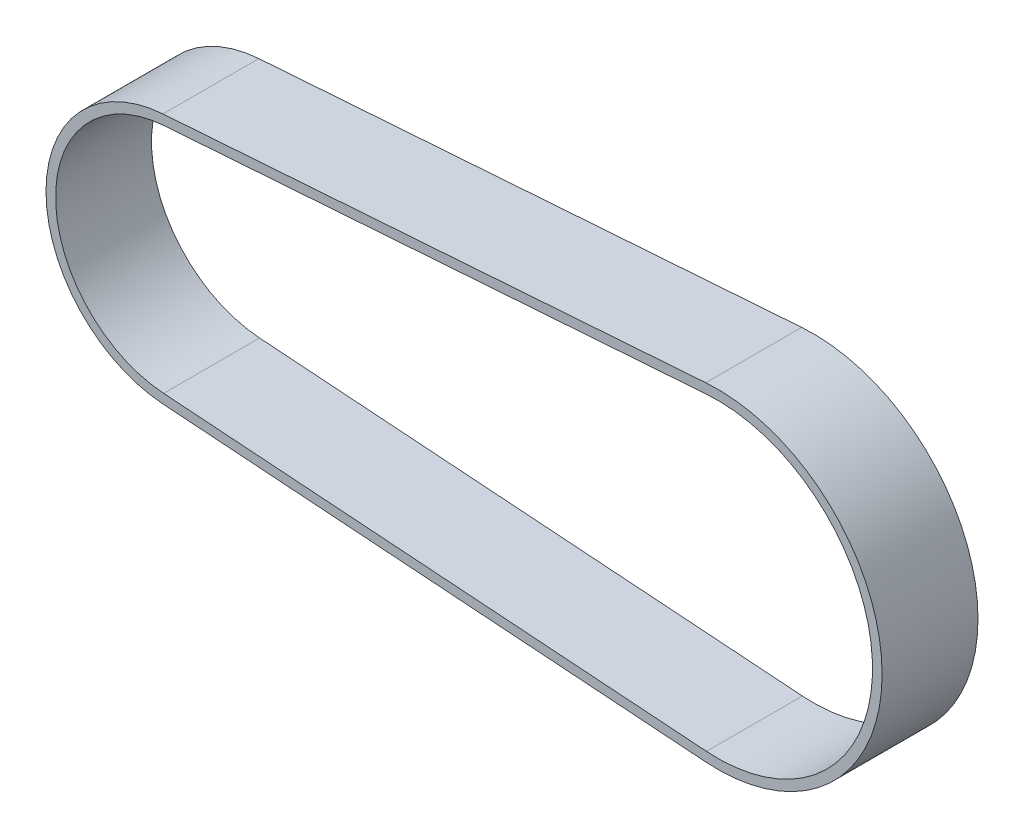
ISO-10303-21;
HEADER;
FILE_DESCRIPTION(('STEP AP214'),'2;1');
FILE_NAME('part.step','',(''),(''),'','','');
FILE_SCHEMA(('AUTOMOTIVE_DESIGN { 1 0 10303 214 1 1 1 1 }'));
ENDSEC;
DATA;
#1=APPLICATION_CONTEXT('core data for automotive mechanical design processes');
#2=APPLICATION_PROTOCOL_DEFINITION('international standard','automotive_design',2000,#1);
#3=PRODUCT_CONTEXT('',#1,'mechanical');
#4=PRODUCT('Part','Part','',(#3));
#5=PRODUCT_RELATED_PRODUCT_CATEGORY('part','',(#4));
#6=PRODUCT_DEFINITION_FORMATION('','',#4);
#7=PRODUCT_DEFINITION_CONTEXT('part definition',#1,'design');
#8=PRODUCT_DEFINITION('design','',#6,#7);
#9=PRODUCT_DEFINITION_SHAPE('','',#8);
#10=(LENGTH_UNIT() NAMED_UNIT(*) SI_UNIT(.MILLI.,.METRE.));
#11=(NAMED_UNIT(*) PLANE_ANGLE_UNIT() SI_UNIT($,.RADIAN.));
#12=(NAMED_UNIT(*) SI_UNIT($,.STERADIAN.) SOLID_ANGLE_UNIT());
#13=UNCERTAINTY_MEASURE_WITH_UNIT(LENGTH_MEASURE(1.E-05),#10,'distance_accuracy_value','');
#14=(GEOMETRIC_REPRESENTATION_CONTEXT(3) GLOBAL_UNCERTAINTY_ASSIGNED_CONTEXT((#13)) GLOBAL_UNIT_ASSIGNED_CONTEXT((#10,
#11,#12)) REPRESENTATION_CONTEXT('',''));
#15=CARTESIAN_POINT('',(0.,0.,0.));
#16=DIRECTION('',(0.,0.,1.));
#17=DIRECTION('',(1.,0.,0.));
#18=AXIS2_PLACEMENT_3D('',#15,#16,#17);
#19=CARTESIAN_POINT('',(0.,0.,5.));
#20=DIRECTION('',(0.,0.,-1.));
#21=DIRECTION('',(-1.,0.,0.));
#22=AXIS2_PLACEMENT_3D('',#19,#20,#21);
#23=PLANE('',#22);
#24=CARTESIAN_POINT('',(0.,0.,5.));
#25=DIRECTION('',(0.,0.,-1.));
#26=DIRECTION('',(-1.,0.,0.));
#27=AXIS2_PLACEMENT_3D('',#24,#25,#26);
#28=CIRCLE('',#27,13.13);
#29=CARTESIAN_POINT('',(-0.932357602726097,13.0968549392837,5.));
#30=VERTEX_POINT('',#29);
#31=CARTESIAN_POINT('',(-0.9323576027261,-13.0968549392837,5.));
#32=VERTEX_POINT('',#31);
#33=EDGE_CURVE('E158',#30,#32,#28,.F.);
#34=ORIENTED_EDGE('',*,*,#33,.T.);
#35=DIRECTION('',(0.997475623707819,-0.0710097184102131,0.));
#36=VECTOR('',#35,1.);
#37=CARTESIAN_POINT('',(-0.932357602726098,-13.0968549392837,5.));
#38=LINE('',#37,#36);
#39=CARTESIAN_POINT('',(55.6743840426926,-17.1266564590633,5.));
#40=VERTEX_POINT('',#39);
#41=EDGE_CURVE('E161',#32,#40,#38,.T.);
#42=ORIENTED_EDGE('',*,*,#41,.T.);
#43=CARTESIAN_POINT('',(56.893620907796,0.,5.));
#44=DIRECTION('',(0.,0.,-1.));
#45=DIRECTION('',(-1.,0.,0.));
#46=AXIS2_PLACEMENT_3D('',#43,#44,#45);
#47=CIRCLE('',#46,17.17);
#48=CARTESIAN_POINT('',(55.6743840426926,17.1266564590632,5.));
#49=VERTEX_POINT('',#48);
#50=EDGE_CURVE('E164',#40,#49,#47,.F.);
#51=ORIENTED_EDGE('',*,*,#50,.T.);
#52=DIRECTION('',(-0.997475623707819,-0.071009718410213,0.));
#53=VECTOR('',#52,1.);
#54=CARTESIAN_POINT('',(-0.932357602726096,13.0968549392837,5.));
#55=LINE('',#54,#53);
#56=EDGE_CURVE('E166',#49,#30,#55,.T.);
#57=ORIENTED_EDGE('',*,*,#56,.T.);
#58=EDGE_LOOP('',(#34,#42,#51,#57));
#59=FACE_BOUND('',#58,.T.);
#60=CARTESIAN_POINT('',(0.,0.,5.));
#61=DIRECTION('',(0.,0.,1.));
#62=DIRECTION('',(-1.,0.,0.));
#63=AXIS2_PLACEMENT_3D('',#60,#61,#62);
#64=CIRCLE('',#63,12.13);
#65=CARTESIAN_POINT('',(-0.861347884315884,12.0993793155758,5.));
#66=VERTEX_POINT('',#65);
#67=CARTESIAN_POINT('',(-0.861347884315884,-12.0993793155758,5.));
#68=VERTEX_POINT('',#67);
#69=EDGE_CURVE('E122',#66,#68,#64,.T.);
#70=ORIENTED_EDGE('',*,*,#69,.F.);
#71=DIRECTION('',(-0.997475623707819,-0.0710097184102129,0.));
#72=VECTOR('',#71,1.);
#73=CARTESIAN_POINT('',(-0.861347884315884,12.0993793155758,5.));
#74=LINE('',#73,#72);
#75=CARTESIAN_POINT('',(55.7453937611028,16.1291808353554,5.));
#76=VERTEX_POINT('',#75);
#77=EDGE_CURVE('E144',#76,#66,#74,.T.);
#78=ORIENTED_EDGE('',*,*,#77,.F.);
#79=CARTESIAN_POINT('',(56.893620907796,0.,5.));
#80=DIRECTION('',(0.,0.,1.));
#81=DIRECTION('',(-1.,0.,0.));
#82=AXIS2_PLACEMENT_3D('',#79,#80,#81);
#83=CIRCLE('',#82,16.17);
#84=CARTESIAN_POINT('',(55.7453937611028,-16.1291808353554,5.));
#85=VERTEX_POINT('',#84);
#86=EDGE_CURVE('E142',#85,#76,#83,.T.);
#87=ORIENTED_EDGE('',*,*,#86,.F.);
#88=DIRECTION('',(0.997475623707819,-0.0710097184102131,0.));
#89=VECTOR('',#88,1.);
#90=CARTESIAN_POINT('',(55.7453937611028,-16.1291808353554,5.));
#91=LINE('',#90,#89);
#92=EDGE_CURVE('E130',#68,#85,#91,.T.);
#93=ORIENTED_EDGE('',*,*,#92,.F.);
#94=EDGE_LOOP('',(#70,#78,#87,#93));
#95=FACE_BOUND('',#94,.T.);
#96=ADVANCED_FACE('F57',(#59,#95),#23,.F.);
#97=CARTESIAN_POINT('',(0.,0.,-5.));
#98=DIRECTION('',(0.,0.,-1.));
#99=DIRECTION('',(-1.,0.,0.));
#100=AXIS2_PLACEMENT_3D('',#97,#98,#99);
#101=PLANE('',#100);
#102=CARTESIAN_POINT('',(0.,0.,-5.));
#103=DIRECTION('',(0.,0.,-1.));
#104=DIRECTION('',(-1.,0.,0.));
#105=AXIS2_PLACEMENT_3D('',#102,#103,#104);
#106=CIRCLE('',#105,13.13);
#107=CARTESIAN_POINT('',(-0.932357602726097,13.0968549392837,-5.));
#108=VERTEX_POINT('',#107);
#109=CARTESIAN_POINT('',(-0.9323576027261,-13.0968549392837,-5.));
#110=VERTEX_POINT('',#109);
#111=EDGE_CURVE('E138',#108,#110,#106,.F.);
#112=ORIENTED_EDGE('',*,*,#111,.F.);
#113=DIRECTION('',(-0.997475623707819,-0.071009718410213,0.));
#114=VECTOR('',#113,1.);
#115=CARTESIAN_POINT('',(-0.932357602726096,13.0968549392837,-5.));
#116=LINE('',#115,#114);
#117=CARTESIAN_POINT('',(55.6743840426926,17.1266564590632,-5.));
#118=VERTEX_POINT('',#117);
#119=EDGE_CURVE('E162',#118,#108,#116,.T.);
#120=ORIENTED_EDGE('',*,*,#119,.F.);
#121=CARTESIAN_POINT('',(56.893620907796,0.,-5.));
#122=DIRECTION('',(0.,0.,-1.));
#123=DIRECTION('',(-1.,0.,0.));
#124=AXIS2_PLACEMENT_3D('',#121,#122,#123);
#125=CIRCLE('',#124,17.17);
#126=CARTESIAN_POINT('',(55.6743840426926,-17.1266564590633,-5.));
#127=VERTEX_POINT('',#126);
#128=EDGE_CURVE('E173',#127,#118,#125,.F.);
#129=ORIENTED_EDGE('',*,*,#128,.F.);
#130=DIRECTION('',(0.997475623707819,-0.0710097184102131,0.));
#131=VECTOR('',#130,1.);
#132=CARTESIAN_POINT('',(-0.932357602726098,-13.0968549392837,-5.));
#133=LINE('',#132,#131);
#134=EDGE_CURVE('E171',#110,#127,#133,.T.);
#135=ORIENTED_EDGE('',*,*,#134,.F.);
#136=EDGE_LOOP('',(#112,#120,#129,#135));
#137=FACE_BOUND('',#136,.T.);
#138=DIRECTION('',(-0.997475623707819,-0.0710097184102129,0.));
#139=VECTOR('',#138,1.);
#140=CARTESIAN_POINT('',(-0.861347884315884,12.0993793155758,-5.));
#141=LINE('',#140,#139);
#142=CARTESIAN_POINT('',(55.7453937611028,16.1291808353554,-5.));
#143=VERTEX_POINT('',#142);
#144=CARTESIAN_POINT('',(-0.861347884315884,12.0993793155758,-5.));
#145=VERTEX_POINT('',#144);
#146=EDGE_CURVE('E131',#143,#145,#141,.T.);
#147=ORIENTED_EDGE('',*,*,#146,.T.);
#148=CARTESIAN_POINT('',(0.,0.,-5.));
#149=DIRECTION('',(0.,0.,1.));
#150=DIRECTION('',(-1.,0.,0.));
#151=AXIS2_PLACEMENT_3D('',#148,#149,#150);
#152=CIRCLE('',#151,12.13);
#153=CARTESIAN_POINT('',(-0.861347884315884,-12.0993793155758,-5.));
#154=VERTEX_POINT('',#153);
#155=EDGE_CURVE('E80',#145,#154,#152,.T.);
#156=ORIENTED_EDGE('',*,*,#155,.T.);
#157=DIRECTION('',(0.997475623707819,-0.0710097184102131,0.));
#158=VECTOR('',#157,1.);
#159=CARTESIAN_POINT('',(55.7453937611028,-16.1291808353554,-5.));
#160=LINE('',#159,#158);
#161=CARTESIAN_POINT('',(55.7453937611028,-16.1291808353554,-5.));
#162=VERTEX_POINT('',#161);
#163=EDGE_CURVE('E137',#154,#162,#160,.T.);
#164=ORIENTED_EDGE('',*,*,#163,.T.);
#165=CARTESIAN_POINT('',(56.893620907796,0.,-5.));
#166=DIRECTION('',(0.,0.,1.));
#167=DIRECTION('',(-1.,0.,0.));
#168=AXIS2_PLACEMENT_3D('',#165,#166,#167);
#169=CIRCLE('',#168,16.17);
#170=EDGE_CURVE('E150',#162,#143,#169,.T.);
#171=ORIENTED_EDGE('',*,*,#170,.T.);
#172=EDGE_LOOP('',(#147,#156,#164,#171));
#173=FACE_BOUND('',#172,.T.);
#174=ADVANCED_FACE('F191',(#137,#173),#101,.T.);
#175=CARTESIAN_POINT('',(0.,0.,5.));
#176=DIRECTION('',(0.,0.,-1.));
#177=DIRECTION('',(-1.,0.,0.));
#178=AXIS2_PLACEMENT_3D('',#175,#176,#177);
#179=CYLINDRICAL_SURFACE('',#178,13.13);
#180=ORIENTED_EDGE('',*,*,#111,.T.);
#181=DIRECTION('',(0.,0.,-1.));
#182=VECTOR('',#181,1.);
#183=CARTESIAN_POINT('',(-0.9323576027261,-13.0968549392837,5.));
#184=LINE('',#183,#182);
#185=EDGE_CURVE('E12',#32,#110,#184,.T.);
#186=ORIENTED_EDGE('',*,*,#185,.F.);
#187=ORIENTED_EDGE('',*,*,#33,.F.);
#188=DIRECTION('',(0.,0.,-1.));
#189=VECTOR('',#188,1.);
#190=CARTESIAN_POINT('',(-0.932357602726097,13.0968549392837,5.));
#191=LINE('',#190,#189);
#192=EDGE_CURVE('E168',#30,#108,#191,.T.);
#193=ORIENTED_EDGE('',*,*,#192,.T.);
#194=EDGE_LOOP('',(#180,#186,#187,#193));
#195=FACE_BOUND('',#194,.T.);
#196=ADVANCED_FACE('F59',(#195),#179,.T.);
#197=CARTESIAN_POINT('',(-0.932357602726098,-13.0968549392837,5.));
#198=DIRECTION('',(0.0710097184102131,0.997475623707819,0.));
#199=DIRECTION('',(-0.997475623707819,0.0710097184102131,0.));
#200=AXIS2_PLACEMENT_3D('',#197,#198,#199);
#201=PLANE('',#200);
#202=ORIENTED_EDGE('',*,*,#134,.T.);
#203=DIRECTION('',(0.,0.,-1.));
#204=VECTOR('',#203,1.);
#205=CARTESIAN_POINT('',(55.6743840426926,-17.1266564590633,5.));
#206=LINE('',#205,#204);
#207=EDGE_CURVE('E65',#40,#127,#206,.T.);
#208=ORIENTED_EDGE('',*,*,#207,.F.);
#209=ORIENTED_EDGE('',*,*,#41,.F.);
#210=ORIENTED_EDGE('',*,*,#185,.T.);
#211=EDGE_LOOP('',(#202,#208,#209,#210));
#212=FACE_BOUND('',#211,.T.);
#213=ADVANCED_FACE('F201',(#212),#201,.F.);
#214=CARTESIAN_POINT('',(56.893620907796,0.,5.));
#215=DIRECTION('',(0.,0.,-1.));
#216=DIRECTION('',(-1.,0.,0.));
#217=AXIS2_PLACEMENT_3D('',#214,#215,#216);
#218=CYLINDRICAL_SURFACE('',#217,17.17);
#219=ORIENTED_EDGE('',*,*,#128,.T.);
#220=DIRECTION('',(0.,0.,-1.));
#221=VECTOR('',#220,1.);
#222=CARTESIAN_POINT('',(55.6743840426926,17.1266564590632,5.));
#223=LINE('',#222,#221);
#224=EDGE_CURVE('E178',#49,#118,#223,.T.);
#225=ORIENTED_EDGE('',*,*,#224,.F.);
#226=ORIENTED_EDGE('',*,*,#50,.F.);
#227=ORIENTED_EDGE('',*,*,#207,.T.);
#228=EDGE_LOOP('',(#219,#225,#226,#227));
#229=FACE_BOUND('',#228,.T.);
#230=ADVANCED_FACE('F185',(#229),#218,.T.);
#231=CARTESIAN_POINT('',(-0.932357602726096,13.0968549392837,5.));
#232=DIRECTION('',(0.071009718410213,-0.997475623707819,0.));
#233=DIRECTION('',(0.997475623707819,0.071009718410213,0.));
#234=AXIS2_PLACEMENT_3D('',#231,#232,#233);
#235=PLANE('',#234);
#236=ORIENTED_EDGE('',*,*,#119,.T.);
#237=ORIENTED_EDGE('',*,*,#192,.F.);
#238=ORIENTED_EDGE('',*,*,#56,.F.);
#239=ORIENTED_EDGE('',*,*,#224,.T.);
#240=EDGE_LOOP('',(#236,#237,#238,#239));
#241=FACE_BOUND('',#240,.T.);
#242=ADVANCED_FACE('F195',(#241),#235,.F.);
#243=CARTESIAN_POINT('',(0.,0.,5.));
#244=DIRECTION('',(0.,0.,-1.));
#245=DIRECTION('',(-1.,0.,0.));
#246=AXIS2_PLACEMENT_3D('',#243,#244,#245);
#247=CYLINDRICAL_SURFACE('',#246,12.13);
#248=ORIENTED_EDGE('',*,*,#155,.F.);
#249=DIRECTION('',(0.,0.,-1.));
#250=VECTOR('',#249,1.);
#251=CARTESIAN_POINT('',(-0.861347884315884,12.0993793155758,5.));
#252=LINE('',#251,#250);
#253=EDGE_CURVE('E126',#66,#145,#252,.T.);
#254=ORIENTED_EDGE('',*,*,#253,.F.);
#255=ORIENTED_EDGE('',*,*,#69,.T.);
#256=DIRECTION('',(0.,0.,-1.));
#257=VECTOR('',#256,1.);
#258=CARTESIAN_POINT('',(-0.861347884315884,-12.0993793155758,5.));
#259=LINE('',#258,#257);
#260=EDGE_CURVE('E125',#68,#154,#259,.T.);
#261=ORIENTED_EDGE('',*,*,#260,.T.);
#262=EDGE_LOOP('',(#248,#254,#255,#261));
#263=FACE_BOUND('',#262,.T.);
#264=ADVANCED_FACE('F124',(#263),#247,.F.);
#265=CARTESIAN_POINT('',(55.7453937611028,-16.1291808353554,5.));
#266=DIRECTION('',(0.0710097184102131,0.997475623707819,0.));
#267=DIRECTION('',(-0.997475623707819,0.0710097184102131,0.));
#268=AXIS2_PLACEMENT_3D('',#265,#266,#267);
#269=PLANE('',#268);
#270=ORIENTED_EDGE('',*,*,#163,.F.);
#271=ORIENTED_EDGE('',*,*,#260,.F.);
#272=ORIENTED_EDGE('',*,*,#92,.T.);
#273=DIRECTION('',(0.,0.,-1.));
#274=VECTOR('',#273,1.);
#275=CARTESIAN_POINT('',(55.7453937611028,-16.1291808353554,5.));
#276=LINE('',#275,#274);
#277=EDGE_CURVE('E139',#85,#162,#276,.T.);
#278=ORIENTED_EDGE('',*,*,#277,.T.);
#279=EDGE_LOOP('',(#270,#271,#272,#278));
#280=FACE_BOUND('',#279,.T.);
#281=ADVANCED_FACE('F134',(#280),#269,.T.);
#282=CARTESIAN_POINT('',(56.893620907796,0.,5.));
#283=DIRECTION('',(0.,0.,-1.));
#284=DIRECTION('',(-1.,0.,0.));
#285=AXIS2_PLACEMENT_3D('',#282,#283,#284);
#286=CYLINDRICAL_SURFACE('',#285,16.17);
#287=ORIENTED_EDGE('',*,*,#170,.F.);
#288=ORIENTED_EDGE('',*,*,#277,.F.);
#289=ORIENTED_EDGE('',*,*,#86,.T.);
#290=DIRECTION('',(0.,0.,-1.));
#291=VECTOR('',#290,1.);
#292=CARTESIAN_POINT('',(55.7453937611028,16.1291808353554,5.));
#293=LINE('',#292,#291);
#294=EDGE_CURVE('E72',#76,#143,#293,.T.);
#295=ORIENTED_EDGE('',*,*,#294,.T.);
#296=EDGE_LOOP('',(#287,#288,#289,#295));
#297=FACE_BOUND('',#296,.T.);
#298=ADVANCED_FACE('F224',(#297),#286,.F.);
#299=CARTESIAN_POINT('',(-0.861347884315884,12.0993793155758,5.));
#300=DIRECTION('',(0.0710097184102129,-0.997475623707819,0.));
#301=DIRECTION('',(0.997475623707819,0.071009718410213,0.));
#302=AXIS2_PLACEMENT_3D('',#299,#300,#301);
#303=PLANE('',#302);
#304=ORIENTED_EDGE('',*,*,#146,.F.);
#305=ORIENTED_EDGE('',*,*,#294,.F.);
#306=ORIENTED_EDGE('',*,*,#77,.T.);
#307=ORIENTED_EDGE('',*,*,#253,.T.);
#308=EDGE_LOOP('',(#304,#305,#306,#307));
#309=FACE_BOUND('',#308,.T.);
#310=ADVANCED_FACE('F228',(#309),#303,.T.);
#311=CLOSED_SHELL('',(#96,#174,#196,#213,#230,#242,#264,#281,#298,#310));
#312=MANIFOLD_SOLID_BREP('B2',#311);
#313=ADVANCED_BREP_SHAPE_REPRESENTATION('',(#18,#312),#14);
#314=SHAPE_DEFINITION_REPRESENTATION(#9,#313);
ENDSEC;
END-ISO-10303-21;
